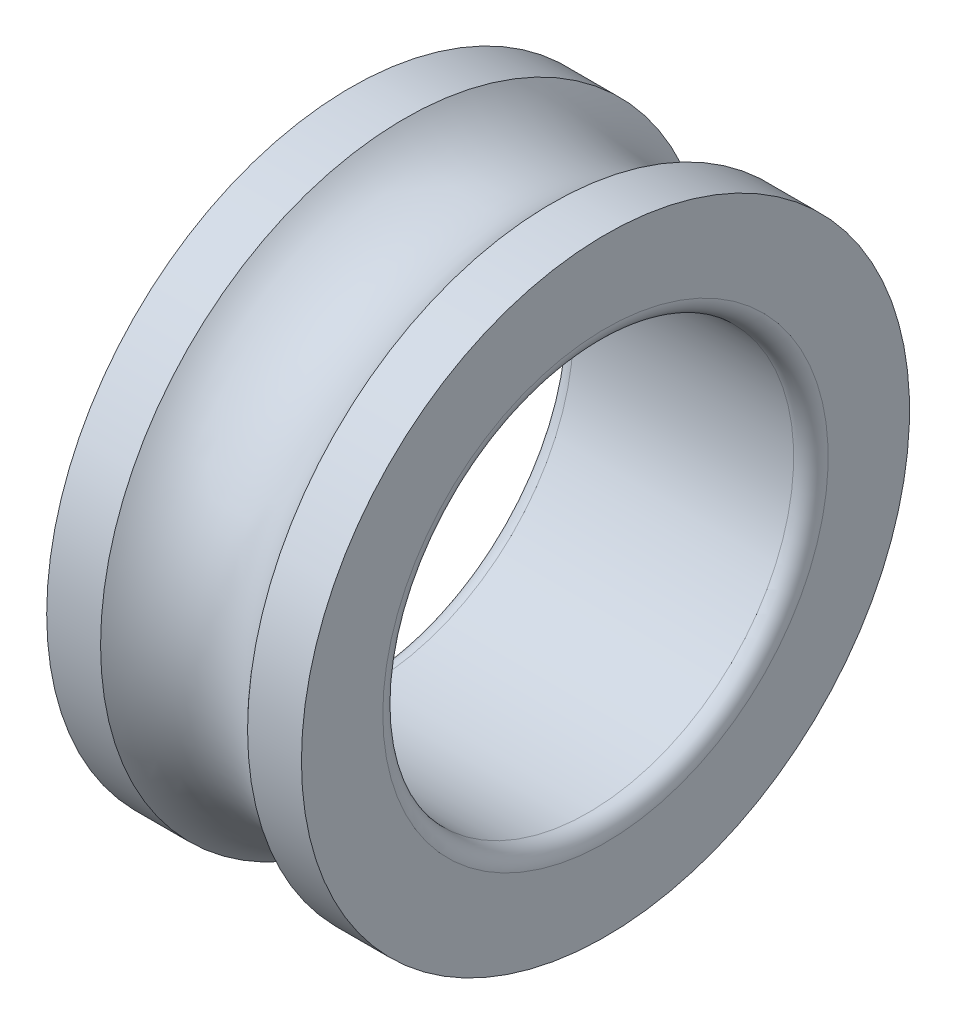
ISO-10303-21;
HEADER;
FILE_DESCRIPTION(('STEP AP214'),'2;1');
FILE_NAME('part.step','',(''),(''),'','','');
FILE_SCHEMA(('AUTOMOTIVE_DESIGN { 1 0 10303 214 1 1 1 1 }'));
ENDSEC;
DATA;
#1=APPLICATION_CONTEXT('core data for automotive mechanical design processes');
#2=APPLICATION_PROTOCOL_DEFINITION('international standard','automotive_design',2000,#1);
#3=PRODUCT_CONTEXT('',#1,'mechanical');
#4=PRODUCT('Part','Part','',(#3));
#5=PRODUCT_RELATED_PRODUCT_CATEGORY('part','',(#4));
#6=PRODUCT_DEFINITION_FORMATION('','',#4);
#7=PRODUCT_DEFINITION_CONTEXT('part definition',#1,'design');
#8=PRODUCT_DEFINITION('design','',#6,#7);
#9=PRODUCT_DEFINITION_SHAPE('','',#8);
#10=(LENGTH_UNIT() NAMED_UNIT(*) SI_UNIT(.MILLI.,.METRE.));
#11=(NAMED_UNIT(*) PLANE_ANGLE_UNIT() SI_UNIT($,.RADIAN.));
#12=(NAMED_UNIT(*) SI_UNIT($,.STERADIAN.) SOLID_ANGLE_UNIT());
#13=UNCERTAINTY_MEASURE_WITH_UNIT(LENGTH_MEASURE(1.E-05),#10,'distance_accuracy_value','');
#14=(GEOMETRIC_REPRESENTATION_CONTEXT(3) GLOBAL_UNCERTAINTY_ASSIGNED_CONTEXT((#13)) GLOBAL_UNIT_ASSIGNED_CONTEXT((#10,
#11,#12)) REPRESENTATION_CONTEXT('',''));
#15=CARTESIAN_POINT('',(0.,0.,0.));
#16=DIRECTION('',(0.,0.,1.));
#17=DIRECTION('',(1.,0.,0.));
#18=AXIS2_PLACEMENT_3D('',#15,#16,#17);
#19=CARTESIAN_POINT('',(-15.5,37.,0.));
#20=DIRECTION('',(1.,0.,0.));
#21=DIRECTION('',(0.,0.,-1.));
#22=AXIS2_PLACEMENT_3D('',#19,#20,#21);
#23=PLANE('',#22);
#24=CARTESIAN_POINT('',(-15.5,0.,0.));
#25=DIRECTION('',(-1.,0.,0.));
#26=DIRECTION('',(0.,0.,1.));
#27=AXIS2_PLACEMENT_3D('',#24,#25,#26);
#28=CIRCLE('',#27,27.1);
#29=CARTESIAN_POINT('',(-15.5,0.,27.1));
#30=VERTEX_POINT('',#29);
#31=EDGE_CURVE('E10',#30,#30,#28,.T.);
#32=ORIENTED_EDGE('',*,*,#31,.F.);
#33=EDGE_LOOP('',(#32));
#34=FACE_BOUND('',#33,.T.);
#35=CARTESIAN_POINT('',(-15.5,0.,0.));
#36=DIRECTION('',(-1.,0.,0.));
#37=DIRECTION('',(0.,0.,1.));
#38=AXIS2_PLACEMENT_3D('',#35,#36,#37);
#39=CIRCLE('',#38,37.);
#40=CARTESIAN_POINT('',(-15.5,0.,37.));
#41=VERTEX_POINT('',#40);
#42=EDGE_CURVE('E64',#41,#41,#39,.T.);
#43=ORIENTED_EDGE('',*,*,#42,.T.);
#44=EDGE_LOOP('',(#43));
#45=FACE_BOUND('',#44,.T.);
#46=ADVANCED_FACE('F36',(#34,#45),#23,.F.);
#47=CARTESIAN_POINT('',(-13.4,0.,0.));
#48=DIRECTION('',(-1.,0.,0.));
#49=DIRECTION('',(0.,0.,1.));
#50=AXIS2_PLACEMENT_3D('',#47,#48,#49);
#51=TOROIDAL_SURFACE('',#50,27.1,2.1);
#52=CARTESIAN_POINT('',(-13.4,0.,0.));
#53=DIRECTION('',(-1.,0.,0.));
#54=DIRECTION('',(0.,0.,1.));
#55=AXIS2_PLACEMENT_3D('',#52,#53,#54);
#56=CIRCLE('',#55,25.);
#57=CARTESIAN_POINT('',(-13.4,0.,25.));
#58=VERTEX_POINT('',#57);
#59=EDGE_CURVE('E42',#58,#58,#56,.T.);
#60=ORIENTED_EDGE('',*,*,#59,.F.);
#61=EDGE_LOOP('',(#60));
#62=FACE_BOUND('',#61,.T.);
#63=ORIENTED_EDGE('',*,*,#31,.T.);
#64=EDGE_LOOP('',(#63));
#65=FACE_BOUND('',#64,.T.);
#66=ADVANCED_FACE('F101',(#62,#65),#51,.T.);
#67=CARTESIAN_POINT('',(-26.7559523809523,0.,0.));
#68=DIRECTION('',(-1.,0.,0.));
#69=DIRECTION('',(0.,0.,1.));
#70=AXIS2_PLACEMENT_3D('',#67,#68,#69);
#71=CYLINDRICAL_SURFACE('',#70,25.);
#72=CARTESIAN_POINT('',(13.4,0.,0.));
#73=DIRECTION('',(-1.,0.,0.));
#74=DIRECTION('',(0.,0.,1.));
#75=AXIS2_PLACEMENT_3D('',#72,#73,#74);
#76=CIRCLE('',#75,25.);
#77=CARTESIAN_POINT('',(13.4,0.,25.));
#78=VERTEX_POINT('',#77);
#79=EDGE_CURVE('E46',#78,#78,#76,.T.);
#80=ORIENTED_EDGE('',*,*,#79,.F.);
#81=EDGE_LOOP('',(#80));
#82=FACE_BOUND('',#81,.T.);
#83=ORIENTED_EDGE('',*,*,#59,.T.);
#84=EDGE_LOOP('',(#83));
#85=FACE_BOUND('',#84,.T.);
#86=ADVANCED_FACE('F96',(#82,#85),#71,.F.);
#87=CARTESIAN_POINT('',(13.4,0.,0.));
#88=DIRECTION('',(-1.,0.,0.));
#89=DIRECTION('',(0.,0.,1.));
#90=AXIS2_PLACEMENT_3D('',#87,#88,#89);
#91=TOROIDAL_SURFACE('',#90,27.1,2.1);
#92=CARTESIAN_POINT('',(15.5,0.,0.));
#93=DIRECTION('',(-1.,0.,0.));
#94=DIRECTION('',(0.,0.,1.));
#95=AXIS2_PLACEMENT_3D('',#92,#93,#94);
#96=CIRCLE('',#95,27.1);
#97=CARTESIAN_POINT('',(15.5,0.,27.1));
#98=VERTEX_POINT('',#97);
#99=EDGE_CURVE('E50',#98,#98,#96,.T.);
#100=ORIENTED_EDGE('',*,*,#99,.F.);
#101=EDGE_LOOP('',(#100));
#102=FACE_BOUND('',#101,.T.);
#103=ORIENTED_EDGE('',*,*,#79,.T.);
#104=EDGE_LOOP('',(#103));
#105=FACE_BOUND('',#104,.T.);
#106=ADVANCED_FACE('F90',(#102,#105),#91,.T.);
#107=CARTESIAN_POINT('',(15.5,37.,0.));
#108=DIRECTION('',(-1.,0.,0.));
#109=DIRECTION('',(0.,0.,1.));
#110=AXIS2_PLACEMENT_3D('',#107,#108,#109);
#111=PLANE('',#110);
#112=CARTESIAN_POINT('',(15.5,0.,0.));
#113=DIRECTION('',(-1.,0.,0.));
#114=DIRECTION('',(0.,0.,1.));
#115=AXIS2_PLACEMENT_3D('',#112,#113,#114);
#116=CIRCLE('',#115,37.);
#117=CARTESIAN_POINT('',(15.5,0.,37.));
#118=VERTEX_POINT('',#117);
#119=EDGE_CURVE('E55',#118,#118,#116,.T.);
#120=ORIENTED_EDGE('',*,*,#119,.F.);
#121=EDGE_LOOP('',(#120));
#122=FACE_BOUND('',#121,.T.);
#123=ORIENTED_EDGE('',*,*,#99,.T.);
#124=EDGE_LOOP('',(#123));
#125=FACE_BOUND('',#124,.T.);
#126=ADVANCED_FACE('F84',(#122,#125),#111,.F.);
#127=CARTESIAN_POINT('',(-26.7559523809523,0.,0.));
#128=DIRECTION('',(-1.,0.,0.));
#129=DIRECTION('',(0.,0.,1.));
#130=AXIS2_PLACEMENT_3D('',#127,#128,#129);
#131=CYLINDRICAL_SURFACE('',#130,37.);
#132=CARTESIAN_POINT('',(8.94427190999916,0.,0.));
#133=DIRECTION('',(-1.,0.,0.));
#134=DIRECTION('',(0.,0.,1.));
#135=AXIS2_PLACEMENT_3D('',#132,#133,#134);
#136=CIRCLE('',#135,37.);
#137=CARTESIAN_POINT('',(8.94427190999916,0.,37.));
#138=VERTEX_POINT('',#137);
#139=EDGE_CURVE('E58',#138,#138,#136,.T.);
#140=ORIENTED_EDGE('',*,*,#139,.F.);
#141=EDGE_LOOP('',(#140));
#142=FACE_BOUND('',#141,.T.);
#143=ORIENTED_EDGE('',*,*,#119,.T.);
#144=EDGE_LOOP('',(#143));
#145=FACE_BOUND('',#144,.T.);
#146=ADVANCED_FACE('F78',(#142,#145),#131,.T.);
#147=CARTESIAN_POINT('',(0.,0.,0.));
#148=DIRECTION('',(-1.,0.,0.));
#149=DIRECTION('',(0.,0.,1.));
#150=AXIS2_PLACEMENT_3D('',#147,#148,#149);
#151=TOROIDAL_SURFACE('',#150,45.,12.);
#152=CARTESIAN_POINT('',(-8.94427190999915,0.,0.));
#153=DIRECTION('',(-1.,0.,0.));
#154=DIRECTION('',(0.,0.,1.));
#155=AXIS2_PLACEMENT_3D('',#152,#153,#154);
#156=CIRCLE('',#155,37.);
#157=CARTESIAN_POINT('',(-8.94427190999915,0.,37.));
#158=VERTEX_POINT('',#157);
#159=EDGE_CURVE('E61',#158,#158,#156,.T.);
#160=ORIENTED_EDGE('',*,*,#159,.F.);
#161=EDGE_LOOP('',(#160));
#162=FACE_BOUND('',#161,.T.);
#163=ORIENTED_EDGE('',*,*,#139,.T.);
#164=EDGE_LOOP('',(#163));
#165=FACE_BOUND('',#164,.T.);
#166=ADVANCED_FACE('F72',(#162,#165),#151,.F.);
#167=CARTESIAN_POINT('',(-26.7559523809523,0.,0.));
#168=DIRECTION('',(-1.,0.,0.));
#169=DIRECTION('',(0.,0.,1.));
#170=AXIS2_PLACEMENT_3D('',#167,#168,#169);
#171=CYLINDRICAL_SURFACE('',#170,37.);
#172=ORIENTED_EDGE('',*,*,#42,.F.);
#173=EDGE_LOOP('',(#172));
#174=FACE_BOUND('',#173,.T.);
#175=ORIENTED_EDGE('',*,*,#159,.T.);
#176=EDGE_LOOP('',(#175));
#177=FACE_BOUND('',#176,.T.);
#178=ADVANCED_FACE('F69',(#174,#177),#171,.T.);
#179=CLOSED_SHELL('',(#46,#66,#86,#106,#126,#146,#166,#178));
#180=MANIFOLD_SOLID_BREP('B2',#179);
#181=ADVANCED_BREP_SHAPE_REPRESENTATION('',(#18,#180),#14);
#182=SHAPE_DEFINITION_REPRESENTATION(#9,#181);
ENDSEC;
END-ISO-10303-21;
